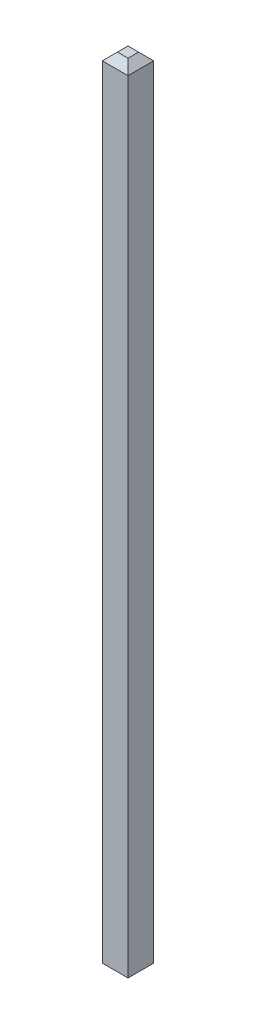
ISO-10303-21;
HEADER;
FILE_DESCRIPTION(('STEP AP214'),'2;1');
FILE_NAME('part.step','',(''),(''),'','','');
FILE_SCHEMA(('AUTOMOTIVE_DESIGN { 1 0 10303 214 1 1 1 1 }'));
ENDSEC;
DATA;
#1=APPLICATION_CONTEXT('core data for automotive mechanical design processes');
#2=APPLICATION_PROTOCOL_DEFINITION('international standard','automotive_design',2000,#1);
#3=PRODUCT_CONTEXT('',#1,'mechanical');
#4=PRODUCT('Part','Part','',(#3));
#5=PRODUCT_RELATED_PRODUCT_CATEGORY('part','',(#4));
#6=PRODUCT_DEFINITION_FORMATION('','',#4);
#7=PRODUCT_DEFINITION_CONTEXT('part definition',#1,'design');
#8=PRODUCT_DEFINITION('design','',#6,#7);
#9=PRODUCT_DEFINITION_SHAPE('','',#8);
#10=(LENGTH_UNIT() NAMED_UNIT(*) SI_UNIT(.MILLI.,.METRE.));
#11=(NAMED_UNIT(*) PLANE_ANGLE_UNIT() SI_UNIT($,.RADIAN.));
#12=(NAMED_UNIT(*) SI_UNIT($,.STERADIAN.) SOLID_ANGLE_UNIT());
#13=UNCERTAINTY_MEASURE_WITH_UNIT(LENGTH_MEASURE(1.E-05),#10,'distance_accuracy_value','');
#14=(GEOMETRIC_REPRESENTATION_CONTEXT(3) GLOBAL_UNCERTAINTY_ASSIGNED_CONTEXT((#13)) GLOBAL_UNIT_ASSIGNED_CONTEXT((#10,
#11,#12)) REPRESENTATION_CONTEXT('',''));
#15=CARTESIAN_POINT('',(0.,0.,0.));
#16=DIRECTION('',(0.,0.,1.));
#17=DIRECTION('',(1.,0.,0.));
#18=AXIS2_PLACEMENT_3D('',#15,#16,#17);
#19=CARTESIAN_POINT('',(0.34,21.08,0.34));
#20=DIRECTION('',(-1.,0.,0.));
#21=DIRECTION('',(0.,0.,1.));
#22=AXIS2_PLACEMENT_3D('',#19,#20,#21);
#23=PLANE('',#22);
#24=DIRECTION('',(0.,-1.,0.));
#25=VECTOR('',#24,1.);
#26=CARTESIAN_POINT('',(0.34,21.08,0.34));
#27=LINE('',#26,#25);
#28=CARTESIAN_POINT('',(0.34,20.88,0.34));
#29=VERTEX_POINT('',#28);
#30=CARTESIAN_POINT('',(0.34,0.199999999999999,0.34));
#31=VERTEX_POINT('',#30);
#32=EDGE_CURVE('E143',#29,#31,#27,.T.);
#33=ORIENTED_EDGE('',*,*,#32,.T.);
#34=DIRECTION('',(0.,0.,-1.));
#35=VECTOR('',#34,1.);
#36=CARTESIAN_POINT('',(0.34,0.199999999999999,-0.34));
#37=LINE('',#36,#35);
#38=CARTESIAN_POINT('',(0.34,0.199999999999999,-0.34));
#39=VERTEX_POINT('',#38);
#40=EDGE_CURVE('E152',#31,#39,#37,.T.);
#41=ORIENTED_EDGE('',*,*,#40,.T.);
#42=DIRECTION('',(0.,-1.,0.));
#43=VECTOR('',#42,1.);
#44=CARTESIAN_POINT('',(0.34,21.08,-0.34));
#45=LINE('',#44,#43);
#46=CARTESIAN_POINT('',(0.34,20.88,-0.34));
#47=VERTEX_POINT('',#46);
#48=EDGE_CURVE('E121',#47,#39,#45,.T.);
#49=ORIENTED_EDGE('',*,*,#48,.F.);
#50=DIRECTION('',(0.,0.,1.));
#51=VECTOR('',#50,1.);
#52=CARTESIAN_POINT('',(0.34,20.88,0.34));
#53=LINE('',#52,#51);
#54=EDGE_CURVE('E154',#47,#29,#53,.T.);
#55=ORIENTED_EDGE('',*,*,#54,.T.);
#56=EDGE_LOOP('',(#33,#41,#49,#55));
#57=FACE_BOUND('',#56,.T.);
#58=ADVANCED_FACE('F34',(#57),#23,.F.);
#59=CARTESIAN_POINT('',(-0.34,21.08,-0.34));
#60=DIRECTION('',(0.,0.,1.));
#61=DIRECTION('',(1.,0.,0.));
#62=AXIS2_PLACEMENT_3D('',#59,#60,#61);
#63=PLANE('',#62);
#64=ORIENTED_EDGE('',*,*,#48,.T.);
#65=DIRECTION('',(-1.,0.,0.));
#66=VECTOR('',#65,1.);
#67=CARTESIAN_POINT('',(-0.34,0.199999999999999,-0.34));
#68=LINE('',#67,#66);
#69=CARTESIAN_POINT('',(-0.34,0.199999999999999,-0.34));
#70=VERTEX_POINT('',#69);
#71=EDGE_CURVE('E120',#39,#70,#68,.T.);
#72=ORIENTED_EDGE('',*,*,#71,.T.);
#73=DIRECTION('',(0.,-1.,0.));
#74=VECTOR('',#73,1.);
#75=CARTESIAN_POINT('',(-0.34,21.08,-0.34));
#76=LINE('',#75,#74);
#77=CARTESIAN_POINT('',(-0.34,20.88,-0.34));
#78=VERTEX_POINT('',#77);
#79=EDGE_CURVE('E103',#78,#70,#76,.T.);
#80=ORIENTED_EDGE('',*,*,#79,.F.);
#81=DIRECTION('',(1.,0.,0.));
#82=VECTOR('',#81,1.);
#83=CARTESIAN_POINT('',(-0.34,20.88,-0.34));
#84=LINE('',#83,#82);
#85=EDGE_CURVE('E117',#78,#47,#84,.T.);
#86=ORIENTED_EDGE('',*,*,#85,.T.);
#87=EDGE_LOOP('',(#64,#72,#80,#86));
#88=FACE_BOUND('',#87,.T.);
#89=ADVANCED_FACE('F116',(#88),#63,.F.);
#90=CARTESIAN_POINT('',(-0.34,21.08,0.34));
#91=DIRECTION('',(1.,0.,0.));
#92=DIRECTION('',(0.,0.,-1.));
#93=AXIS2_PLACEMENT_3D('',#90,#91,#92);
#94=PLANE('',#93);
#95=ORIENTED_EDGE('',*,*,#79,.T.);
#96=DIRECTION('',(0.,0.,1.));
#97=VECTOR('',#96,1.);
#98=CARTESIAN_POINT('',(-0.34,0.199999999999999,0.34));
#99=LINE('',#98,#97);
#100=CARTESIAN_POINT('',(-0.34,0.199999999999999,0.34));
#101=VERTEX_POINT('',#100);
#102=EDGE_CURVE('E109',#70,#101,#99,.T.);
#103=ORIENTED_EDGE('',*,*,#102,.T.);
#104=DIRECTION('',(0.,-1.,0.));
#105=VECTOR('',#104,1.);
#106=CARTESIAN_POINT('',(-0.34,21.08,0.34));
#107=LINE('',#106,#105);
#108=CARTESIAN_POINT('',(-0.34,20.88,0.34));
#109=VERTEX_POINT('',#108);
#110=EDGE_CURVE('E105',#109,#101,#107,.T.);
#111=ORIENTED_EDGE('',*,*,#110,.F.);
#112=DIRECTION('',(0.,0.,-1.));
#113=VECTOR('',#112,1.);
#114=CARTESIAN_POINT('',(-0.34,20.88,0.34));
#115=LINE('',#114,#113);
#116=EDGE_CURVE('E100',#109,#78,#115,.T.);
#117=ORIENTED_EDGE('',*,*,#116,.T.);
#118=EDGE_LOOP('',(#95,#103,#111,#117));
#119=FACE_BOUND('',#118,.T.);
#120=ADVANCED_FACE('F102',(#119),#94,.F.);
#121=CARTESIAN_POINT('',(-0.34,21.08,0.34));
#122=DIRECTION('',(0.,0.,-1.));
#123=DIRECTION('',(-1.,0.,0.));
#124=AXIS2_PLACEMENT_3D('',#121,#122,#123);
#125=PLANE('',#124);
#126=ORIENTED_EDGE('',*,*,#110,.T.);
#127=DIRECTION('',(1.,0.,0.));
#128=VECTOR('',#127,1.);
#129=CARTESIAN_POINT('',(0.34,0.199999999999999,0.34));
#130=LINE('',#129,#128);
#131=EDGE_CURVE('E156',#101,#31,#130,.T.);
#132=ORIENTED_EDGE('',*,*,#131,.T.);
#133=ORIENTED_EDGE('',*,*,#32,.F.);
#134=DIRECTION('',(-1.,0.,0.));
#135=VECTOR('',#134,1.);
#136=CARTESIAN_POINT('',(-0.34,20.88,0.34));
#137=LINE('',#136,#135);
#138=EDGE_CURVE('E158',#29,#109,#137,.T.);
#139=ORIENTED_EDGE('',*,*,#138,.T.);
#140=EDGE_LOOP('',(#126,#132,#133,#139));
#141=FACE_BOUND('',#140,.T.);
#142=ADVANCED_FACE('F196',(#141),#125,.F.);
#143=CARTESIAN_POINT('',(0.,21.08,0.));
#144=DIRECTION('',(0.,-1.,0.));
#145=DIRECTION('',(0.,0.,-1.));
#146=AXIS2_PLACEMENT_3D('',#143,#144,#145);
#147=PLANE('',#146);
#148=DIRECTION('',(0.,0.,1.));
#149=VECTOR('',#148,1.);
#150=CARTESIAN_POINT('',(-0.140000000000003,21.08,0.));
#151=LINE('',#150,#149);
#152=CARTESIAN_POINT('',(-0.140000000000003,21.08,-0.140000000000003));
#153=VERTEX_POINT('',#152);
#154=CARTESIAN_POINT('',(-0.140000000000003,21.08,0.140000000000003));
#155=VERTEX_POINT('',#154);
#156=EDGE_CURVE('E43',#153,#155,#151,.T.);
#157=ORIENTED_EDGE('',*,*,#156,.T.);
#158=DIRECTION('',(1.,0.,0.));
#159=VECTOR('',#158,1.);
#160=CARTESIAN_POINT('',(0.,21.08,0.140000000000003));
#161=LINE('',#160,#159);
#162=CARTESIAN_POINT('',(0.140000000000003,21.08,0.140000000000003));
#163=VERTEX_POINT('',#162);
#164=EDGE_CURVE('E11',#155,#163,#161,.T.);
#165=ORIENTED_EDGE('',*,*,#164,.T.);
#166=DIRECTION('',(0.,0.,-1.));
#167=VECTOR('',#166,1.);
#168=CARTESIAN_POINT('',(0.140000000000003,21.08,0.));
#169=LINE('',#168,#167);
#170=CARTESIAN_POINT('',(0.140000000000003,21.08,-0.140000000000003));
#171=VERTEX_POINT('',#170);
#172=EDGE_CURVE('E150',#163,#171,#169,.T.);
#173=ORIENTED_EDGE('',*,*,#172,.T.);
#174=DIRECTION('',(-1.,0.,0.));
#175=VECTOR('',#174,1.);
#176=CARTESIAN_POINT('',(0.,21.08,-0.140000000000003));
#177=LINE('',#176,#175);
#178=EDGE_CURVE('E54',#171,#153,#177,.T.);
#179=ORIENTED_EDGE('',*,*,#178,.T.);
#180=EDGE_LOOP('',(#157,#165,#173,#179));
#181=FACE_BOUND('',#180,.T.);
#182=ADVANCED_FACE('F202',(#181),#147,.F.);
#183=CARTESIAN_POINT('',(0.,0.,0.));
#184=DIRECTION('',(0.,-1.,0.));
#185=DIRECTION('',(0.,0.,-1.));
#186=AXIS2_PLACEMENT_3D('',#183,#184,#185);
#187=PLANE('',#186);
#188=DIRECTION('',(0.,0.,-1.));
#189=VECTOR('',#188,1.);
#190=CARTESIAN_POINT('',(-0.139999999999998,0.,-0.34));
#191=LINE('',#190,#189);
#192=CARTESIAN_POINT('',(-0.139999999999998,0.,0.139999999999998));
#193=VERTEX_POINT('',#192);
#194=CARTESIAN_POINT('',(-0.139999999999998,0.,-0.139999999999998));
#195=VERTEX_POINT('',#194);
#196=EDGE_CURVE('E163',#193,#195,#191,.T.);
#197=ORIENTED_EDGE('',*,*,#196,.T.);
#198=DIRECTION('',(1.,0.,0.));
#199=VECTOR('',#198,1.);
#200=CARTESIAN_POINT('',(0.34,0.,-0.139999999999998));
#201=LINE('',#200,#199);
#202=CARTESIAN_POINT('',(0.139999999999998,0.,-0.139999999999998));
#203=VERTEX_POINT('',#202);
#204=EDGE_CURVE('E110',#195,#203,#201,.T.);
#205=ORIENTED_EDGE('',*,*,#204,.T.);
#206=DIRECTION('',(0.,0.,1.));
#207=VECTOR('',#206,1.);
#208=CARTESIAN_POINT('',(0.139999999999998,0.,0.34));
#209=LINE('',#208,#207);
#210=CARTESIAN_POINT('',(0.139999999999998,0.,0.139999999999998));
#211=VERTEX_POINT('',#210);
#212=EDGE_CURVE('E167',#203,#211,#209,.T.);
#213=ORIENTED_EDGE('',*,*,#212,.T.);
#214=DIRECTION('',(-1.,0.,0.));
#215=VECTOR('',#214,1.);
#216=CARTESIAN_POINT('',(-0.34,0.,0.139999999999998));
#217=LINE('',#216,#215);
#218=EDGE_CURVE('E165',#211,#193,#217,.T.);
#219=ORIENTED_EDGE('',*,*,#218,.T.);
#220=EDGE_LOOP('',(#197,#205,#213,#219));
#221=FACE_BOUND('',#220,.T.);
#222=ADVANCED_FACE('F204',(#221),#187,.T.);
#223=CARTESIAN_POINT('',(-0.34,0.199999999999999,0.34));
#224=DIRECTION('',(0.,-0.707106781186554,0.707106781186541));
#225=DIRECTION('',(-1.,0.,0.));
#226=AXIS2_PLACEMENT_3D('',#223,#224,#225);
#227=PLANE('',#226);
#228=DIRECTION('',(0.577350269189629,-0.577350269189619,-0.577350269189629));
#229=VECTOR('',#228,1.);
#230=CARTESIAN_POINT('',(-0.34,0.199999999999999,0.34));
#231=LINE('',#230,#229);
#232=EDGE_CURVE('E144',#193,#101,#231,.F.);
#233=ORIENTED_EDGE('',*,*,#232,.F.);
#234=ORIENTED_EDGE('',*,*,#218,.F.);
#235=DIRECTION('',(-0.577350269189629,-0.577350269189619,-0.577350269189629));
#236=VECTOR('',#235,1.);
#237=CARTESIAN_POINT('',(0.34,0.199999999999999,0.34));
#238=LINE('',#237,#236);
#239=EDGE_CURVE('E140',#31,#211,#238,.T.);
#240=ORIENTED_EDGE('',*,*,#239,.F.);
#241=ORIENTED_EDGE('',*,*,#131,.F.);
#242=EDGE_LOOP('',(#233,#234,#240,#241));
#243=FACE_BOUND('',#242,.T.);
#244=ADVANCED_FACE('F183',(#243),#227,.T.);
#245=CARTESIAN_POINT('',(0.34,0.199999999999999,0.34));
#246=DIRECTION('',(0.707106781186541,-0.707106781186554,0.));
#247=DIRECTION('',(0.,0.,1.));
#248=AXIS2_PLACEMENT_3D('',#245,#246,#247);
#249=PLANE('',#248);
#250=ORIENTED_EDGE('',*,*,#239,.T.);
#251=ORIENTED_EDGE('',*,*,#212,.F.);
#252=DIRECTION('',(0.577350269189629,0.577350269189619,-0.577350269189629));
#253=VECTOR('',#252,1.);
#254=CARTESIAN_POINT('',(0.113333333333331,-0.0266666666666666,-0.113333333333331));
#255=LINE('',#254,#253);
#256=EDGE_CURVE('E131',#39,#203,#255,.F.);
#257=ORIENTED_EDGE('',*,*,#256,.F.);
#258=ORIENTED_EDGE('',*,*,#40,.F.);
#259=EDGE_LOOP('',(#250,#251,#257,#258));
#260=FACE_BOUND('',#259,.T.);
#261=ADVANCED_FACE('F187',(#260),#249,.T.);
#262=CARTESIAN_POINT('',(-0.34,0.199999999999999,0.34));
#263=DIRECTION('',(-0.707106781186541,-0.707106781186554,0.));
#264=DIRECTION('',(0.,0.,-1.));
#265=AXIS2_PLACEMENT_3D('',#262,#263,#264);
#266=PLANE('',#265);
#267=ORIENTED_EDGE('',*,*,#232,.T.);
#268=ORIENTED_EDGE('',*,*,#102,.F.);
#269=DIRECTION('',(0.577350269189629,-0.577350269189619,0.577350269189629));
#270=VECTOR('',#269,1.);
#271=CARTESIAN_POINT('',(-0.113333333333331,-0.0266666666666666,-0.113333333333331));
#272=LINE('',#271,#270);
#273=EDGE_CURVE('E130',#195,#70,#272,.F.);
#274=ORIENTED_EDGE('',*,*,#273,.F.);
#275=ORIENTED_EDGE('',*,*,#196,.F.);
#276=EDGE_LOOP('',(#267,#268,#274,#275));
#277=FACE_BOUND('',#276,.T.);
#278=ADVANCED_FACE('F195',(#277),#266,.T.);
#279=CARTESIAN_POINT('',(-0.34,0.199999999999999,-0.34));
#280=DIRECTION('',(0.,-0.707106781186554,-0.707106781186541));
#281=DIRECTION('',(1.,0.,0.));
#282=AXIS2_PLACEMENT_3D('',#279,#280,#281);
#283=PLANE('',#282);
#284=ORIENTED_EDGE('',*,*,#256,.T.);
#285=ORIENTED_EDGE('',*,*,#204,.F.);
#286=ORIENTED_EDGE('',*,*,#273,.T.);
#287=ORIENTED_EDGE('',*,*,#71,.F.);
#288=EDGE_LOOP('',(#284,#285,#286,#287));
#289=FACE_BOUND('',#288,.T.);
#290=ADVANCED_FACE('F190',(#289),#283,.T.);
#291=CARTESIAN_POINT('',(0.,21.08,-0.140000000000003));
#292=DIRECTION('',(0.,-0.707106781186544,0.707106781186551));
#293=DIRECTION('',(-1.,0.,0.));
#294=AXIS2_PLACEMENT_3D('',#291,#292,#293);
#295=PLANE('',#294);
#296=DIRECTION('',(-0.577350269189624,0.577350269189629,0.577350269189624));
#297=VECTOR('',#296,1.);
#298=CARTESIAN_POINT('',(0.0933333333333355,21.1266666666667,-0.0933333333333356));
#299=LINE('',#298,#297);
#300=EDGE_CURVE('E126',#47,#171,#299,.T.);
#301=ORIENTED_EDGE('',*,*,#300,.F.);
#302=ORIENTED_EDGE('',*,*,#85,.F.);
#303=DIRECTION('',(0.577350269189624,0.577350269189629,0.577350269189624));
#304=VECTOR('',#303,1.);
#305=CARTESIAN_POINT('',(-0.0933333333333356,21.1266666666667,-0.0933333333333356));
#306=LINE('',#305,#304);
#307=EDGE_CURVE('E38',#153,#78,#306,.F.);
#308=ORIENTED_EDGE('',*,*,#307,.F.);
#309=ORIENTED_EDGE('',*,*,#178,.F.);
#310=EDGE_LOOP('',(#301,#302,#308,#309));
#311=FACE_BOUND('',#310,.T.);
#312=ADVANCED_FACE('F36',(#311),#295,.F.);
#313=CARTESIAN_POINT('',(-0.140000000000003,21.08,0.));
#314=DIRECTION('',(0.707106781186551,-0.707106781186544,0.));
#315=DIRECTION('',(0.,0.,1.));
#316=AXIS2_PLACEMENT_3D('',#313,#314,#315);
#317=PLANE('',#316);
#318=ORIENTED_EDGE('',*,*,#307,.T.);
#319=ORIENTED_EDGE('',*,*,#116,.F.);
#320=DIRECTION('',(0.577350269189624,0.577350269189629,-0.577350269189624));
#321=VECTOR('',#320,1.);
#322=CARTESIAN_POINT('',(-0.0933333333333356,21.1266666666667,0.0933333333333356));
#323=LINE('',#322,#321);
#324=EDGE_CURVE('E133',#155,#109,#323,.F.);
#325=ORIENTED_EDGE('',*,*,#324,.F.);
#326=ORIENTED_EDGE('',*,*,#156,.F.);
#327=EDGE_LOOP('',(#318,#319,#325,#326));
#328=FACE_BOUND('',#327,.T.);
#329=ADVANCED_FACE('F129',(#328),#317,.F.);
#330=CARTESIAN_POINT('',(0.140000000000003,21.08,0.));
#331=DIRECTION('',(-0.707106781186551,-0.707106781186544,0.));
#332=DIRECTION('',(0.,0.,-1.));
#333=AXIS2_PLACEMENT_3D('',#330,#331,#332);
#334=PLANE('',#333);
#335=ORIENTED_EDGE('',*,*,#300,.T.);
#336=ORIENTED_EDGE('',*,*,#172,.F.);
#337=DIRECTION('',(0.577350269189624,-0.577350269189629,0.577350269189624));
#338=VECTOR('',#337,1.);
#339=CARTESIAN_POINT('',(0.0933333333333355,21.1266666666667,0.0933333333333356));
#340=LINE('',#339,#338);
#341=EDGE_CURVE('E136',#29,#163,#340,.F.);
#342=ORIENTED_EDGE('',*,*,#341,.F.);
#343=ORIENTED_EDGE('',*,*,#54,.F.);
#344=EDGE_LOOP('',(#335,#336,#342,#343));
#345=FACE_BOUND('',#344,.T.);
#346=ADVANCED_FACE('F201',(#345),#334,.F.);
#347=CARTESIAN_POINT('',(0.,21.08,0.140000000000003));
#348=DIRECTION('',(0.,-0.707106781186544,-0.707106781186551));
#349=DIRECTION('',(1.,0.,0.));
#350=AXIS2_PLACEMENT_3D('',#347,#348,#349);
#351=PLANE('',#350);
#352=ORIENTED_EDGE('',*,*,#324,.T.);
#353=ORIENTED_EDGE('',*,*,#138,.F.);
#354=ORIENTED_EDGE('',*,*,#341,.T.);
#355=ORIENTED_EDGE('',*,*,#164,.F.);
#356=EDGE_LOOP('',(#352,#353,#354,#355));
#357=FACE_BOUND('',#356,.T.);
#358=ADVANCED_FACE('F199',(#357),#351,.F.);
#359=CLOSED_SHELL('',(#58,#89,#120,#142,#182,#222,#244,#261,#278,#290,#312,#329,#346,#358));
#360=MANIFOLD_SOLID_BREP('B2',#359);
#361=ADVANCED_BREP_SHAPE_REPRESENTATION('',(#18,#360),#14);
#362=SHAPE_DEFINITION_REPRESENTATION(#9,#361);
ENDSEC;
END-ISO-10303-21;
